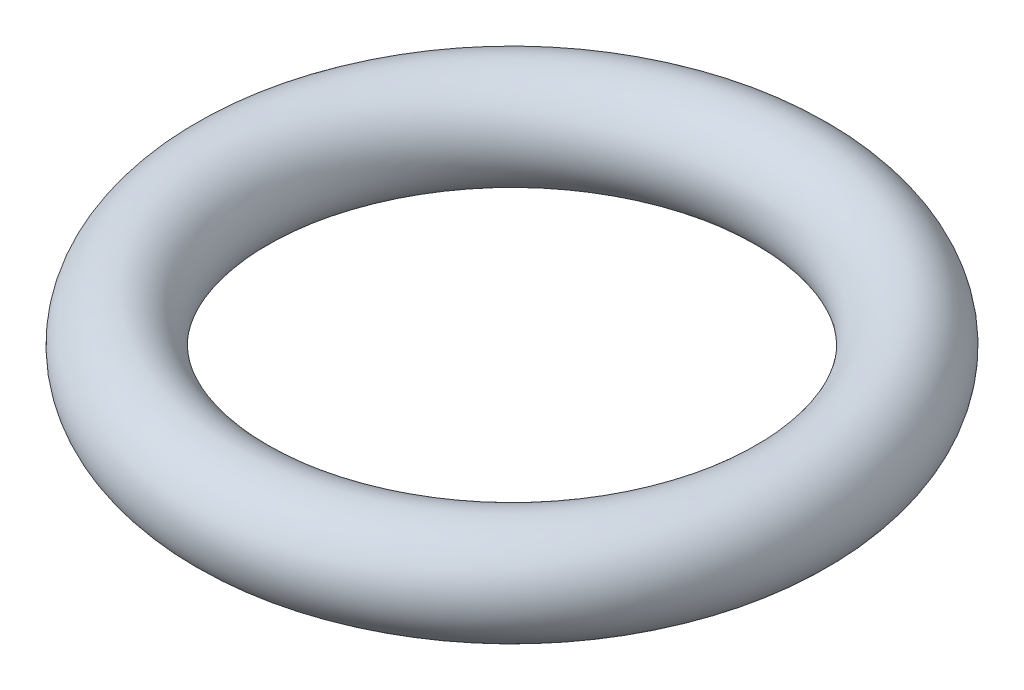
ISO-10303-21;
HEADER;
FILE_DESCRIPTION(('STEP AP214'),'2;1');
FILE_NAME('part.step','',(''),(''),'','','');
FILE_SCHEMA(('AUTOMOTIVE_DESIGN { 1 0 10303 214 1 1 1 1 }'));
ENDSEC;
DATA;
#1=APPLICATION_CONTEXT('core data for automotive mechanical design processes');
#2=APPLICATION_PROTOCOL_DEFINITION('international standard','automotive_design',2000,#1);
#3=PRODUCT_CONTEXT('',#1,'mechanical');
#4=PRODUCT('Part','Part','',(#3));
#5=PRODUCT_RELATED_PRODUCT_CATEGORY('part','',(#4));
#6=PRODUCT_DEFINITION_FORMATION('','',#4);
#7=PRODUCT_DEFINITION_CONTEXT('part definition',#1,'design');
#8=PRODUCT_DEFINITION('design','',#6,#7);
#9=PRODUCT_DEFINITION_SHAPE('','',#8);
#10=(LENGTH_UNIT() NAMED_UNIT(*) SI_UNIT(.MILLI.,.METRE.));
#11=(NAMED_UNIT(*) PLANE_ANGLE_UNIT() SI_UNIT($,.RADIAN.));
#12=(NAMED_UNIT(*) SI_UNIT($,.STERADIAN.) SOLID_ANGLE_UNIT());
#13=UNCERTAINTY_MEASURE_WITH_UNIT(LENGTH_MEASURE(1.E-05),#10,'distance_accuracy_value','');
#14=(GEOMETRIC_REPRESENTATION_CONTEXT(3) GLOBAL_UNCERTAINTY_ASSIGNED_CONTEXT((#13)) GLOBAL_UNIT_ASSIGNED_CONTEXT((#10,
#11,#12)) REPRESENTATION_CONTEXT('',''));
#15=CARTESIAN_POINT('',(0.,0.,0.));
#16=DIRECTION('',(0.,0.,1.));
#17=DIRECTION('',(1.,0.,0.));
#18=AXIS2_PLACEMENT_3D('',#15,#16,#17);
#19=CARTESIAN_POINT('',(0.,0.,0.));
#20=DIRECTION('',(0.,1.,0.));
#21=DIRECTION('',(0.,0.,1.));
#22=AXIS2_PLACEMENT_3D('',#19,#20,#21);
#23=TOROIDAL_SURFACE('',#22,13.9753883785177,2.5);
#24=CARTESIAN_POINT('',(0.,0.,13.9753883785177));
#25=DIRECTION('',(1.,0.,0.));
#26=DIRECTION('',(0.,0.,-1.));
#27=AXIS2_PLACEMENT_3D('',#24,#25,#26);
#28=CIRCLE('',#27,2.5);
#29=CARTESIAN_POINT('',(0.,0.,16.4753883785177));
#30=VERTEX_POINT('',#29);
#31=EDGE_CURVE('E10',#30,#30,#28,.T.);
#32=CARTESIAN_POINT('',(0.,0.,0.));
#33=DIRECTION('',(0.,1.,0.));
#34=DIRECTION('',(0.,0.,1.));
#35=AXIS2_PLACEMENT_3D('',#32,#33,#34);
#36=CIRCLE('',#35,16.4753883785177);
#37=EDGE_CURVE('',#30,#30,#36,.T.);
#38=ORIENTED_EDGE('',*,*,#31,.T.);
#39=ORIENTED_EDGE('',*,*,#31,.F.);
#40=ORIENTED_EDGE('',*,*,#37,.T.);
#41=ORIENTED_EDGE('',*,*,#37,.F.);
#42=EDGE_LOOP('',(#38,#40,#39,#41));
#43=FACE_BOUND('',#42,.T.);
#44=ADVANCED_FACE('F35',(#43),#23,.T.);
#45=CLOSED_SHELL('',(#44));
#46=MANIFOLD_SOLID_BREP('B2',#45);
#47=ADVANCED_BREP_SHAPE_REPRESENTATION('',(#18,#46),#14);
#48=SHAPE_DEFINITION_REPRESENTATION(#9,#47);
ENDSEC;
END-ISO-10303-21;
